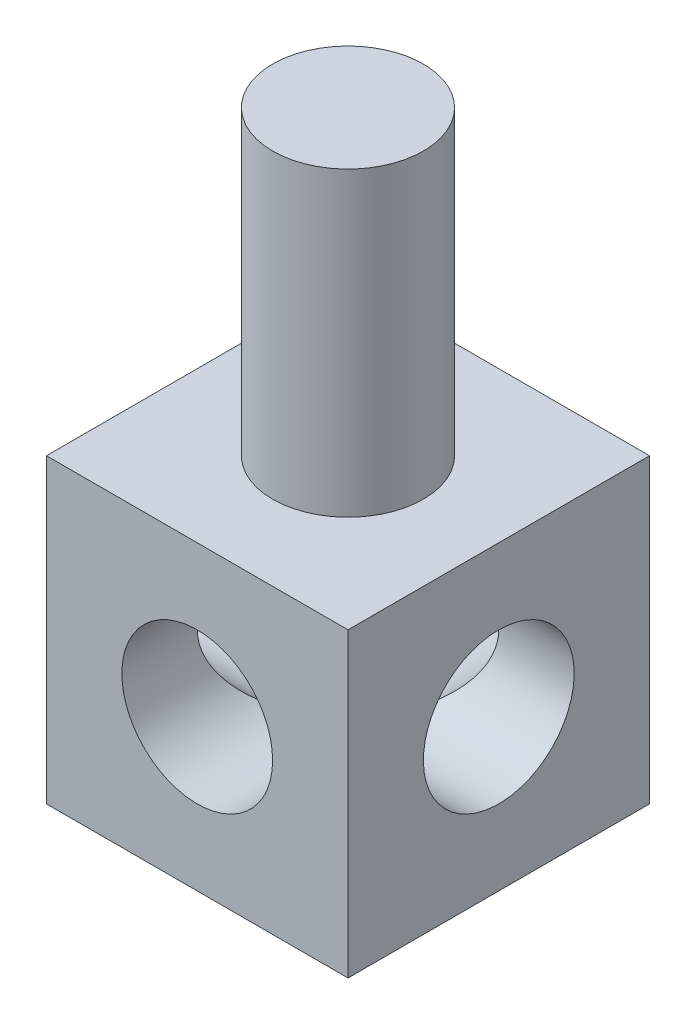
ISO-10303-21;
HEADER;
FILE_DESCRIPTION(('STEP AP214'),'2;1');
FILE_NAME('part.step','',(''),(''),'','','');
FILE_SCHEMA(('AUTOMOTIVE_DESIGN { 1 0 10303 214 1 1 1 1 }'));
ENDSEC;
DATA;
#1=APPLICATION_CONTEXT('core data for automotive mechanical design processes');
#2=APPLICATION_PROTOCOL_DEFINITION('international standard','automotive_design',2000,#1);
#3=PRODUCT_CONTEXT('',#1,'mechanical');
#4=PRODUCT('Part','Part','',(#3));
#5=PRODUCT_RELATED_PRODUCT_CATEGORY('part','',(#4));
#6=PRODUCT_DEFINITION_FORMATION('','',#4);
#7=PRODUCT_DEFINITION_CONTEXT('part definition',#1,'design');
#8=PRODUCT_DEFINITION('design','',#6,#7);
#9=PRODUCT_DEFINITION_SHAPE('','',#8);
#10=(LENGTH_UNIT() NAMED_UNIT(*) SI_UNIT(.MILLI.,.METRE.));
#11=(NAMED_UNIT(*) PLANE_ANGLE_UNIT() SI_UNIT($,.RADIAN.));
#12=(NAMED_UNIT(*) SI_UNIT($,.STERADIAN.) SOLID_ANGLE_UNIT());
#13=UNCERTAINTY_MEASURE_WITH_UNIT(LENGTH_MEASURE(1.E-05),#10,'distance_accuracy_value','');
#14=(GEOMETRIC_REPRESENTATION_CONTEXT(3) GLOBAL_UNCERTAINTY_ASSIGNED_CONTEXT((#13)) GLOBAL_UNIT_ASSIGNED_CONTEXT((#10,
#11,#12)) REPRESENTATION_CONTEXT('',''));
#15=CARTESIAN_POINT('',(0.,0.,0.));
#16=DIRECTION('',(0.,0.,1.));
#17=DIRECTION('',(1.,0.,0.));
#18=AXIS2_PLACEMENT_3D('',#15,#16,#17);
#19=CARTESIAN_POINT('',(5.,5.,0.));
#20=DIRECTION('',(0.,0.,1.));
#21=DIRECTION('',(1.,0.,0.));
#22=AXIS2_PLACEMENT_3D('',#19,#20,#21);
#23=CYLINDRICAL_SURFACE('',#22,2.5);
#24=CARTESIAN_POINT('',(5.,5.,10.));
#25=DIRECTION('',(0.,0.,1.));
#26=DIRECTION('',(1.,0.,0.));
#27=AXIS2_PLACEMENT_3D('',#24,#25,#26);
#28=CIRCLE('',#27,2.5);
#29=CARTESIAN_POINT('',(7.5,5.,10.));
#30=VERTEX_POINT('',#29);
#31=EDGE_CURVE('E154',#30,#30,#28,.T.);
#32=ORIENTED_EDGE('',*,*,#31,.T.);
#33=EDGE_LOOP('',(#32));
#34=FACE_BOUND('',#33,.T.);
#35=CARTESIAN_POINT('',(5.,5.,5.));
#36=DIRECTION('',(-0.707106781186547,0.,0.707106781186547));
#37=DIRECTION('',(0.707106781186547,0.,0.707106781186547));
#38=AXIS2_PLACEMENT_3D('',#35,#36,#37);
#39=ELLIPSE('',#38,3.53553390593274,2.5);
#40=CARTESIAN_POINT('',(5.,7.5,5.));
#41=VERTEX_POINT('',#40);
#42=CARTESIAN_POINT('',(5.,2.5,5.));
#43=VERTEX_POINT('',#42);
#44=EDGE_CURVE('E52',#41,#43,#39,.F.);
#45=ORIENTED_EDGE('',*,*,#44,.T.);
#46=CARTESIAN_POINT('',(5.,5.,5.));
#47=DIRECTION('',(0.707106781186547,0.,0.707106781186547));
#48=DIRECTION('',(-0.707106781186547,0.,0.707106781186547));
#49=AXIS2_PLACEMENT_3D('',#46,#47,#48);
#50=ELLIPSE('',#49,3.53553390593274,2.5);
#51=EDGE_CURVE('E11',#43,#41,#50,.F.);
#52=ORIENTED_EDGE('',*,*,#51,.T.);
#53=EDGE_LOOP('',(#45,#52));
#54=FACE_BOUND('',#53,.T.);
#55=ADVANCED_FACE('F38',(#34,#54),#23,.F.);
#56=CARTESIAN_POINT('',(0.,0.,10.));
#57=DIRECTION('',(1.,0.,0.));
#58=DIRECTION('',(0.,0.,-1.));
#59=AXIS2_PLACEMENT_3D('',#56,#57,#58);
#60=PLANE('',#59);
#61=CARTESIAN_POINT('',(0.,5.,5.));
#62=DIRECTION('',(1.,0.,0.));
#63=DIRECTION('',(0.,1.,0.));
#64=AXIS2_PLACEMENT_3D('',#61,#62,#63);
#65=CIRCLE('',#64,2.5);
#66=CARTESIAN_POINT('',(0.,7.5,5.));
#67=VERTEX_POINT('',#66);
#68=EDGE_CURVE('E158',#67,#67,#65,.T.);
#69=ORIENTED_EDGE('',*,*,#68,.T.);
#70=EDGE_LOOP('',(#69));
#71=FACE_BOUND('',#70,.T.);
#72=DIRECTION('',(0.,-1.,0.));
#73=VECTOR('',#72,1.);
#74=CARTESIAN_POINT('',(0.,0.,0.));
#75=LINE('',#74,#73);
#76=CARTESIAN_POINT('',(0.,10.,0.));
#77=VERTEX_POINT('',#76);
#78=CARTESIAN_POINT('',(0.,0.,0.));
#79=VERTEX_POINT('',#78);
#80=EDGE_CURVE('E133',#77,#79,#75,.T.);
#81=ORIENTED_EDGE('',*,*,#80,.T.);
#82=DIRECTION('',(0.,0.,-1.));
#83=VECTOR('',#82,1.);
#84=CARTESIAN_POINT('',(0.,0.,10.));
#85=LINE('',#84,#83);
#86=CARTESIAN_POINT('',(0.,0.,10.));
#87=VERTEX_POINT('',#86);
#88=EDGE_CURVE('E111',#87,#79,#85,.T.);
#89=ORIENTED_EDGE('',*,*,#88,.F.);
#90=DIRECTION('',(0.,-1.,0.));
#91=VECTOR('',#90,1.);
#92=CARTESIAN_POINT('',(0.,0.,10.));
#93=LINE('',#92,#91);
#94=CARTESIAN_POINT('',(0.,10.,10.));
#95=VERTEX_POINT('',#94);
#96=EDGE_CURVE('E126',#95,#87,#93,.T.);
#97=ORIENTED_EDGE('',*,*,#96,.F.);
#98=DIRECTION('',(0.,0.,-1.));
#99=VECTOR('',#98,1.);
#100=CARTESIAN_POINT('',(0.,10.,10.));
#101=LINE('',#100,#99);
#102=EDGE_CURVE('E121',#95,#77,#101,.T.);
#103=ORIENTED_EDGE('',*,*,#102,.T.);
#104=EDGE_LOOP('',(#81,#89,#97,#103));
#105=FACE_BOUND('',#104,.T.);
#106=ADVANCED_FACE('F40',(#71,#105),#60,.F.);
#107=CARTESIAN_POINT('',(0.,0.,10.));
#108=DIRECTION('',(0.,1.,0.));
#109=DIRECTION('',(0.,0.,1.));
#110=AXIS2_PLACEMENT_3D('',#107,#108,#109);
#111=PLANE('',#110);
#112=DIRECTION('',(1.,0.,0.));
#113=VECTOR('',#112,1.);
#114=CARTESIAN_POINT('',(0.,0.,0.));
#115=LINE('',#114,#113);
#116=CARTESIAN_POINT('',(10.,0.,0.));
#117=VERTEX_POINT('',#116);
#118=EDGE_CURVE('E130',#79,#117,#115,.T.);
#119=ORIENTED_EDGE('',*,*,#118,.T.);
#120=DIRECTION('',(0.,0.,-1.));
#121=VECTOR('',#120,1.);
#122=CARTESIAN_POINT('',(10.,0.,10.));
#123=LINE('',#122,#121);
#124=CARTESIAN_POINT('',(10.,0.,10.));
#125=VERTEX_POINT('',#124);
#126=EDGE_CURVE('E114',#125,#117,#123,.T.);
#127=ORIENTED_EDGE('',*,*,#126,.F.);
#128=DIRECTION('',(1.,0.,0.));
#129=VECTOR('',#128,1.);
#130=CARTESIAN_POINT('',(0.,0.,10.));
#131=LINE('',#130,#129);
#132=EDGE_CURVE('E90',#87,#125,#131,.T.);
#133=ORIENTED_EDGE('',*,*,#132,.F.);
#134=ORIENTED_EDGE('',*,*,#88,.T.);
#135=EDGE_LOOP('',(#119,#127,#133,#134));
#136=FACE_BOUND('',#135,.T.);
#137=ADVANCED_FACE('F184',(#136),#111,.F.);
#138=CARTESIAN_POINT('',(10.,0.,10.));
#139=DIRECTION('',(-1.,0.,0.));
#140=DIRECTION('',(0.,-1.,0.));
#141=AXIS2_PLACEMENT_3D('',#138,#139,#140);
#142=PLANE('',#141);
#143=CARTESIAN_POINT('',(10.,5.00000000000001,5.));
#144=DIRECTION('',(1.,0.,0.));
#145=DIRECTION('',(0.,1.,0.));
#146=AXIS2_PLACEMENT_3D('',#143,#144,#145);
#147=CIRCLE('',#146,2.5);
#148=CARTESIAN_POINT('',(10.,7.50000000000001,5.));
#149=VERTEX_POINT('',#148);
#150=EDGE_CURVE('E162',#149,#149,#147,.T.);
#151=ORIENTED_EDGE('',*,*,#150,.F.);
#152=EDGE_LOOP('',(#151));
#153=FACE_BOUND('',#152,.T.);
#154=DIRECTION('',(0.,1.,0.));
#155=VECTOR('',#154,1.);
#156=CARTESIAN_POINT('',(10.,0.,0.));
#157=LINE('',#156,#155);
#158=CARTESIAN_POINT('',(10.,10.,0.));
#159=VERTEX_POINT('',#158);
#160=EDGE_CURVE('E127',#117,#159,#157,.T.);
#161=ORIENTED_EDGE('',*,*,#160,.T.);
#162=DIRECTION('',(0.,0.,-1.));
#163=VECTOR('',#162,1.);
#164=CARTESIAN_POINT('',(10.,10.,10.));
#165=LINE('',#164,#163);
#166=CARTESIAN_POINT('',(10.,10.,10.));
#167=VERTEX_POINT('',#166);
#168=EDGE_CURVE('E118',#167,#159,#165,.T.);
#169=ORIENTED_EDGE('',*,*,#168,.F.);
#170=DIRECTION('',(0.,1.,0.));
#171=VECTOR('',#170,1.);
#172=CARTESIAN_POINT('',(10.,0.,10.));
#173=LINE('',#172,#171);
#174=EDGE_CURVE('E140',#125,#167,#173,.T.);
#175=ORIENTED_EDGE('',*,*,#174,.F.);
#176=ORIENTED_EDGE('',*,*,#126,.T.);
#177=EDGE_LOOP('',(#161,#169,#175,#176));
#178=FACE_BOUND('',#177,.T.);
#179=ADVANCED_FACE('F210',(#153,#178),#142,.F.);
#180=CARTESIAN_POINT('',(0.,10.,10.));
#181=DIRECTION('',(0.,-1.,0.));
#182=DIRECTION('',(0.,0.,-1.));
#183=AXIS2_PLACEMENT_3D('',#180,#181,#182);
#184=PLANE('',#183);
#185=CARTESIAN_POINT('',(5.,10.,5.));
#186=DIRECTION('',(0.,1.,0.));
#187=DIRECTION('',(0.,0.,1.));
#188=AXIS2_PLACEMENT_3D('',#185,#186,#187);
#189=CIRCLE('',#188,2.5);
#190=CARTESIAN_POINT('',(5.,10.,7.5));
#191=VERTEX_POINT('',#190);
#192=EDGE_CURVE('E105',#191,#191,#189,.T.);
#193=ORIENTED_EDGE('',*,*,#192,.F.);
#194=EDGE_LOOP('',(#193));
#195=FACE_BOUND('',#194,.T.);
#196=DIRECTION('',(-1.,0.,0.));
#197=VECTOR('',#196,1.);
#198=CARTESIAN_POINT('',(0.,10.,0.));
#199=LINE('',#198,#197);
#200=EDGE_CURVE('E82',#159,#77,#199,.T.);
#201=ORIENTED_EDGE('',*,*,#200,.T.);
#202=ORIENTED_EDGE('',*,*,#102,.F.);
#203=DIRECTION('',(-1.,0.,0.));
#204=VECTOR('',#203,1.);
#205=CARTESIAN_POINT('',(0.,10.,10.));
#206=LINE('',#205,#204);
#207=EDGE_CURVE('E61',#167,#95,#206,.T.);
#208=ORIENTED_EDGE('',*,*,#207,.F.);
#209=ORIENTED_EDGE('',*,*,#168,.T.);
#210=EDGE_LOOP('',(#201,#202,#208,#209));
#211=FACE_BOUND('',#210,.T.);
#212=ADVANCED_FACE('F203',(#195,#211),#184,.F.);
#213=CARTESIAN_POINT('',(0.,0.,10.));
#214=DIRECTION('',(0.,0.,-1.));
#215=DIRECTION('',(-1.,0.,0.));
#216=AXIS2_PLACEMENT_3D('',#213,#214,#215);
#217=PLANE('',#216);
#218=ORIENTED_EDGE('',*,*,#31,.F.);
#219=EDGE_LOOP('',(#218));
#220=FACE_BOUND('',#219,.T.);
#221=ORIENTED_EDGE('',*,*,#96,.T.);
#222=ORIENTED_EDGE('',*,*,#132,.T.);
#223=ORIENTED_EDGE('',*,*,#174,.T.);
#224=ORIENTED_EDGE('',*,*,#207,.T.);
#225=EDGE_LOOP('',(#221,#222,#223,#224));
#226=FACE_BOUND('',#225,.T.);
#227=ADVANCED_FACE('F200',(#220,#226),#217,.F.);
#228=CARTESIAN_POINT('',(0.,0.,0.));
#229=DIRECTION('',(0.,0.,-1.));
#230=DIRECTION('',(-1.,0.,0.));
#231=AXIS2_PLACEMENT_3D('',#228,#229,#230);
#232=PLANE('',#231);
#233=CARTESIAN_POINT('',(5.,5.,0.));
#234=DIRECTION('',(0.,0.,1.));
#235=DIRECTION('',(1.,0.,0.));
#236=AXIS2_PLACEMENT_3D('',#233,#234,#235);
#237=CIRCLE('',#236,2.5);
#238=CARTESIAN_POINT('',(7.5,5.,0.));
#239=VERTEX_POINT('',#238);
#240=EDGE_CURVE('E153',#239,#239,#237,.T.);
#241=ORIENTED_EDGE('',*,*,#240,.T.);
#242=EDGE_LOOP('',(#241));
#243=FACE_BOUND('',#242,.T.);
#244=ORIENTED_EDGE('',*,*,#80,.F.);
#245=ORIENTED_EDGE('',*,*,#200,.F.);
#246=ORIENTED_EDGE('',*,*,#160,.F.);
#247=ORIENTED_EDGE('',*,*,#118,.F.);
#248=EDGE_LOOP('',(#244,#245,#246,#247));
#249=FACE_BOUND('',#248,.T.);
#250=ADVANCED_FACE('F196',(#243,#249),#232,.T.);
#251=CARTESIAN_POINT('',(5.,20.,5.));
#252=DIRECTION('',(0.,-1.,0.));
#253=DIRECTION('',(0.,0.,-1.));
#254=AXIS2_PLACEMENT_3D('',#251,#252,#253);
#255=CYLINDRICAL_SURFACE('',#254,2.5);
#256=CARTESIAN_POINT('',(5.,20.,5.));
#257=DIRECTION('',(0.,1.,0.));
#258=DIRECTION('',(0.,0.,1.));
#259=AXIS2_PLACEMENT_3D('',#256,#257,#258);
#260=CIRCLE('',#259,2.5);
#261=CARTESIAN_POINT('',(5.,20.,7.5));
#262=VERTEX_POINT('',#261);
#263=EDGE_CURVE('E137',#262,#262,#260,.T.);
#264=ORIENTED_EDGE('',*,*,#263,.F.);
#265=EDGE_LOOP('',(#264));
#266=FACE_BOUND('',#265,.T.);
#267=ORIENTED_EDGE('',*,*,#192,.T.);
#268=EDGE_LOOP('',(#267));
#269=FACE_BOUND('',#268,.T.);
#270=ADVANCED_FACE('F191',(#266,#269),#255,.T.);
#271=CARTESIAN_POINT('',(5.,20.,5.));
#272=DIRECTION('',(0.,1.,0.));
#273=DIRECTION('',(0.,0.,1.));
#274=AXIS2_PLACEMENT_3D('',#271,#272,#273);
#275=PLANE('',#274);
#276=ORIENTED_EDGE('',*,*,#263,.T.);
#277=EDGE_LOOP('',(#276));
#278=FACE_BOUND('',#277,.T.);
#279=ADVANCED_FACE('F187',(#278),#275,.T.);
#280=CARTESIAN_POINT('',(5.,5.,5.));
#281=DIRECTION('',(-0.707106781186547,0.,0.707106781186547));
#282=DIRECTION('',(0.707106781186547,0.,0.707106781186547));
#283=AXIS2_PLACEMENT_3D('',#280,#281,#282);
#284=ELLIPSE('',#283,3.53553390593274,2.5);
#285=EDGE_CURVE('E96',#41,#43,#284,.T.);
#286=ORIENTED_EDGE('',*,*,#285,.T.);
#287=CARTESIAN_POINT('',(5.,5.,5.));
#288=DIRECTION('',(0.707106781186547,0.,0.707106781186547));
#289=DIRECTION('',(-0.707106781186547,0.,0.707106781186547));
#290=AXIS2_PLACEMENT_3D('',#287,#288,#289);
#291=ELLIPSE('',#290,3.53553390593274,2.5);
#292=EDGE_CURVE('E47',#43,#41,#291,.T.);
#293=ORIENTED_EDGE('',*,*,#292,.T.);
#294=EDGE_LOOP('',(#286,#293));
#295=FACE_BOUND('',#294,.T.);
#296=ORIENTED_EDGE('',*,*,#240,.F.);
#297=EDGE_LOOP('',(#296));
#298=FACE_BOUND('',#297,.T.);
#299=ADVANCED_FACE('F107',(#295,#298),#23,.F.);
#300=CARTESIAN_POINT('',(0.,5.,5.));
#301=DIRECTION('',(1.,0.,0.));
#302=DIRECTION('',(0.,1.,0.));
#303=AXIS2_PLACEMENT_3D('',#300,#301,#302);
#304=CYLINDRICAL_SURFACE('',#303,2.5);
#305=ORIENTED_EDGE('',*,*,#150,.T.);
#306=EDGE_LOOP('',(#305));
#307=FACE_BOUND('',#306,.T.);
#308=ORIENTED_EDGE('',*,*,#44,.F.);
#309=ORIENTED_EDGE('',*,*,#292,.F.);
#310=EDGE_LOOP('',(#308,#309));
#311=FACE_BOUND('',#310,.T.);
#312=ADVANCED_FACE('F103',(#307,#311),#304,.F.);
#313=ORIENTED_EDGE('',*,*,#68,.F.);
#314=EDGE_LOOP('',(#313));
#315=FACE_BOUND('',#314,.T.);
#316=ORIENTED_EDGE('',*,*,#285,.F.);
#317=ORIENTED_EDGE('',*,*,#51,.F.);
#318=EDGE_LOOP('',(#316,#317));
#319=FACE_BOUND('',#318,.T.);
#320=ADVANCED_FACE('F97',(#315,#319),#304,.F.);
#321=CLOSED_SHELL('',(#55,#106,#137,#179,#212,#227,#250,#270,#279,#299,#312,#320));
#322=MANIFOLD_SOLID_BREP('B2',#321);
#323=ADVANCED_BREP_SHAPE_REPRESENTATION('',(#18,#322),#14);
#324=SHAPE_DEFINITION_REPRESENTATION(#9,#323);
ENDSEC;
END-ISO-10303-21;
